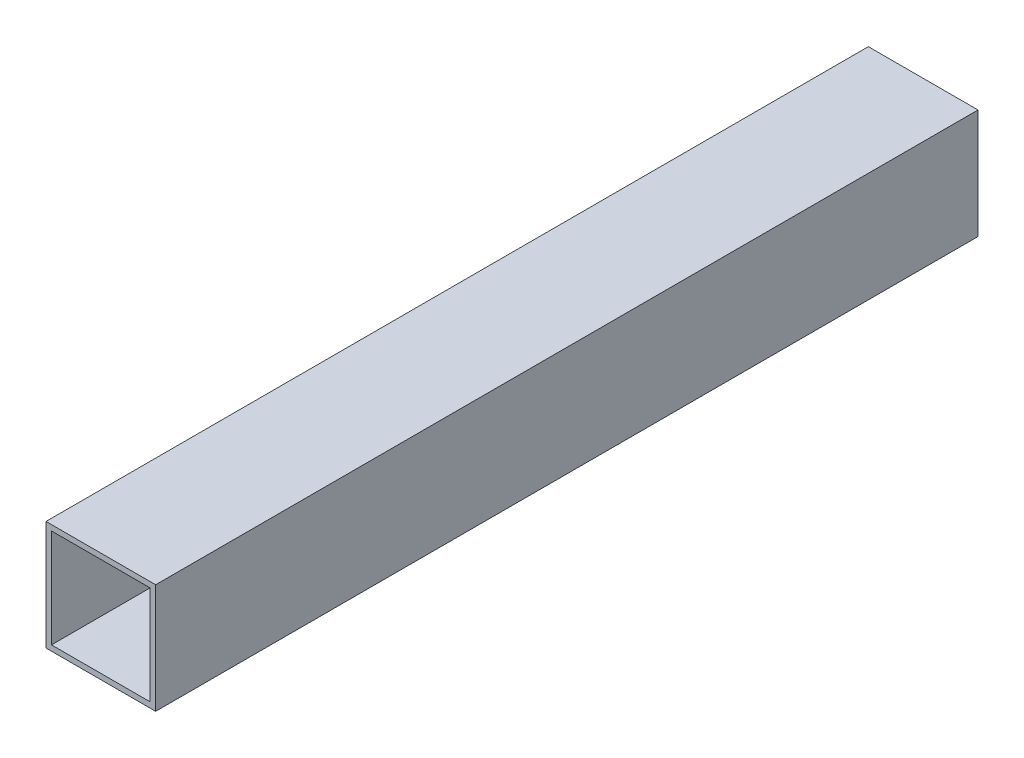
ISO-10303-21;
HEADER;
FILE_DESCRIPTION(('STEP AP214'),'2;1');
FILE_NAME('part.step','',(''),(''),'','','');
FILE_SCHEMA(('AUTOMOTIVE_DESIGN { 1 0 10303 214 1 1 1 1 }'));
ENDSEC;
DATA;
#1=APPLICATION_CONTEXT('core data for automotive mechanical design processes');
#2=APPLICATION_PROTOCOL_DEFINITION('international standard','automotive_design',2000,#1);
#3=PRODUCT_CONTEXT('',#1,'mechanical');
#4=PRODUCT('Part','Part','',(#3));
#5=PRODUCT_RELATED_PRODUCT_CATEGORY('part','',(#4));
#6=PRODUCT_DEFINITION_FORMATION('','',#4);
#7=PRODUCT_DEFINITION_CONTEXT('part definition',#1,'design');
#8=PRODUCT_DEFINITION('design','',#6,#7);
#9=PRODUCT_DEFINITION_SHAPE('','',#8);
#10=(LENGTH_UNIT() NAMED_UNIT(*) SI_UNIT(.MILLI.,.METRE.));
#11=(NAMED_UNIT(*) PLANE_ANGLE_UNIT() SI_UNIT($,.RADIAN.));
#12=(NAMED_UNIT(*) SI_UNIT($,.STERADIAN.) SOLID_ANGLE_UNIT());
#13=UNCERTAINTY_MEASURE_WITH_UNIT(LENGTH_MEASURE(1.E-05),#10,'distance_accuracy_value','');
#14=(GEOMETRIC_REPRESENTATION_CONTEXT(3) GLOBAL_UNCERTAINTY_ASSIGNED_CONTEXT((#13)) GLOBAL_UNIT_ASSIGNED_CONTEXT((#10,
#11,#12)) REPRESENTATION_CONTEXT('',''));
#15=CARTESIAN_POINT('',(0.,0.,0.));
#16=DIRECTION('',(0.,0.,1.));
#17=DIRECTION('',(1.,0.,0.));
#18=AXIS2_PLACEMENT_3D('',#15,#16,#17);
#19=CARTESIAN_POINT('',(0.,0.,150.));
#20=DIRECTION('',(0.,0.,-1.));
#21=DIRECTION('',(-1.,0.,0.));
#22=AXIS2_PLACEMENT_3D('',#19,#20,#21);
#23=PLANE('',#22);
#24=DIRECTION('',(0.,1.,0.));
#25=VECTOR('',#24,1.);
#26=CARTESIAN_POINT('',(12.5,-7.5,150.));
#27=LINE('',#26,#25);
#28=CARTESIAN_POINT('',(12.5,-7.5,150.));
#29=VERTEX_POINT('',#28);
#30=CARTESIAN_POINT('',(12.5,12.5,150.));
#31=VERTEX_POINT('',#30);
#32=EDGE_CURVE('E143',#29,#31,#27,.T.);
#33=ORIENTED_EDGE('',*,*,#32,.T.);
#34=DIRECTION('',(-1.,0.,0.));
#35=VECTOR('',#34,1.);
#36=CARTESIAN_POINT('',(-7.5,12.5,150.));
#37=LINE('',#36,#35);
#38=CARTESIAN_POINT('',(-7.5,12.5,150.));
#39=VERTEX_POINT('',#38);
#40=EDGE_CURVE('E146',#31,#39,#37,.T.);
#41=ORIENTED_EDGE('',*,*,#40,.T.);
#42=DIRECTION('',(0.,-1.,0.));
#43=VECTOR('',#42,1.);
#44=CARTESIAN_POINT('',(-7.5,-7.5,150.));
#45=LINE('',#44,#43);
#46=CARTESIAN_POINT('',(-7.5,-7.5,150.));
#47=VERTEX_POINT('',#46);
#48=EDGE_CURVE('E149',#39,#47,#45,.T.);
#49=ORIENTED_EDGE('',*,*,#48,.T.);
#50=DIRECTION('',(1.,0.,0.));
#51=VECTOR('',#50,1.);
#52=CARTESIAN_POINT('',(-7.5,-7.5,150.));
#53=LINE('',#52,#51);
#54=EDGE_CURVE('E151',#47,#29,#53,.T.);
#55=ORIENTED_EDGE('',*,*,#54,.T.);
#56=EDGE_LOOP('',(#33,#41,#49,#55));
#57=FACE_BOUND('',#56,.T.);
#58=DIRECTION('',(0.,-1.,0.));
#59=VECTOR('',#58,1.);
#60=CARTESIAN_POINT('',(-6.5,-6.5,150.));
#61=LINE('',#60,#59);
#62=CARTESIAN_POINT('',(-6.5,11.5,150.));
#63=VERTEX_POINT('',#62);
#64=CARTESIAN_POINT('',(-6.5,-6.5,150.));
#65=VERTEX_POINT('',#64);
#66=EDGE_CURVE('E107',#63,#65,#61,.T.);
#67=ORIENTED_EDGE('',*,*,#66,.F.);
#68=DIRECTION('',(-1.,0.,0.));
#69=VECTOR('',#68,1.);
#70=CARTESIAN_POINT('',(-6.5,11.5,150.));
#71=LINE('',#70,#69);
#72=CARTESIAN_POINT('',(11.5,11.5,150.));
#73=VERTEX_POINT('',#72);
#74=EDGE_CURVE('E129',#73,#63,#71,.T.);
#75=ORIENTED_EDGE('',*,*,#74,.F.);
#76=DIRECTION('',(0.,1.,0.));
#77=VECTOR('',#76,1.);
#78=CARTESIAN_POINT('',(11.5,-6.5,150.));
#79=LINE('',#78,#77);
#80=CARTESIAN_POINT('',(11.5,-6.5,150.));
#81=VERTEX_POINT('',#80);
#82=EDGE_CURVE('E127',#81,#73,#79,.T.);
#83=ORIENTED_EDGE('',*,*,#82,.F.);
#84=DIRECTION('',(1.,0.,0.));
#85=VECTOR('',#84,1.);
#86=CARTESIAN_POINT('',(-6.5,-6.5,150.));
#87=LINE('',#86,#85);
#88=EDGE_CURVE('E115',#65,#81,#87,.T.);
#89=ORIENTED_EDGE('',*,*,#88,.F.);
#90=EDGE_LOOP('',(#67,#75,#83,#89));
#91=FACE_BOUND('',#90,.T.);
#92=ADVANCED_FACE('F42',(#57,#91),#23,.F.);
#93=CARTESIAN_POINT('',(0.,0.,0.));
#94=DIRECTION('',(0.,0.,-1.));
#95=DIRECTION('',(-1.,0.,0.));
#96=AXIS2_PLACEMENT_3D('',#93,#94,#95);
#97=PLANE('',#96);
#98=DIRECTION('',(0.,1.,0.));
#99=VECTOR('',#98,1.);
#100=CARTESIAN_POINT('',(12.5,-7.5,0.));
#101=LINE('',#100,#99);
#102=CARTESIAN_POINT('',(12.5,-7.5,0.));
#103=VERTEX_POINT('',#102);
#104=CARTESIAN_POINT('',(12.5,12.5,0.));
#105=VERTEX_POINT('',#104);
#106=EDGE_CURVE('E123',#103,#105,#101,.T.);
#107=ORIENTED_EDGE('',*,*,#106,.F.);
#108=DIRECTION('',(1.,0.,0.));
#109=VECTOR('',#108,1.);
#110=CARTESIAN_POINT('',(-7.5,-7.5,0.));
#111=LINE('',#110,#109);
#112=CARTESIAN_POINT('',(-7.5,-7.5,0.));
#113=VERTEX_POINT('',#112);
#114=EDGE_CURVE('E147',#113,#103,#111,.T.);
#115=ORIENTED_EDGE('',*,*,#114,.F.);
#116=DIRECTION('',(0.,-1.,0.));
#117=VECTOR('',#116,1.);
#118=CARTESIAN_POINT('',(-7.5,-7.5,0.));
#119=LINE('',#118,#117);
#120=CARTESIAN_POINT('',(-7.5,12.5,0.));
#121=VERTEX_POINT('',#120);
#122=EDGE_CURVE('E158',#121,#113,#119,.T.);
#123=ORIENTED_EDGE('',*,*,#122,.F.);
#124=DIRECTION('',(-1.,0.,0.));
#125=VECTOR('',#124,1.);
#126=CARTESIAN_POINT('',(-7.5,12.5,0.));
#127=LINE('',#126,#125);
#128=EDGE_CURVE('E156',#105,#121,#127,.T.);
#129=ORIENTED_EDGE('',*,*,#128,.F.);
#130=EDGE_LOOP('',(#107,#115,#123,#129));
#131=FACE_BOUND('',#130,.T.);
#132=DIRECTION('',(-1.,0.,0.));
#133=VECTOR('',#132,1.);
#134=CARTESIAN_POINT('',(-6.5,11.5,0.));
#135=LINE('',#134,#133);
#136=CARTESIAN_POINT('',(11.5,11.5,0.));
#137=VERTEX_POINT('',#136);
#138=CARTESIAN_POINT('',(-6.5,11.5,0.));
#139=VERTEX_POINT('',#138);
#140=EDGE_CURVE('E116',#137,#139,#135,.T.);
#141=ORIENTED_EDGE('',*,*,#140,.T.);
#142=DIRECTION('',(0.,-1.,0.));
#143=VECTOR('',#142,1.);
#144=CARTESIAN_POINT('',(-6.5,-6.5,0.));
#145=LINE('',#144,#143);
#146=CARTESIAN_POINT('',(-6.5,-6.5,0.));
#147=VERTEX_POINT('',#146);
#148=EDGE_CURVE('E65',#139,#147,#145,.T.);
#149=ORIENTED_EDGE('',*,*,#148,.T.);
#150=DIRECTION('',(1.,0.,0.));
#151=VECTOR('',#150,1.);
#152=CARTESIAN_POINT('',(-6.5,-6.5,0.));
#153=LINE('',#152,#151);
#154=CARTESIAN_POINT('',(11.5,-6.5,0.));
#155=VERTEX_POINT('',#154);
#156=EDGE_CURVE('E122',#147,#155,#153,.T.);
#157=ORIENTED_EDGE('',*,*,#156,.T.);
#158=DIRECTION('',(0.,1.,0.));
#159=VECTOR('',#158,1.);
#160=CARTESIAN_POINT('',(11.5,-6.5,0.));
#161=LINE('',#160,#159);
#162=EDGE_CURVE('E135',#155,#137,#161,.T.);
#163=ORIENTED_EDGE('',*,*,#162,.T.);
#164=EDGE_LOOP('',(#141,#149,#157,#163));
#165=FACE_BOUND('',#164,.T.);
#166=ADVANCED_FACE('F176',(#131,#165),#97,.T.);
#167=CARTESIAN_POINT('',(12.5,-7.5,150.));
#168=DIRECTION('',(-1.,0.,0.));
#169=DIRECTION('',(0.,0.,1.));
#170=AXIS2_PLACEMENT_3D('',#167,#168,#169);
#171=PLANE('',#170);
#172=ORIENTED_EDGE('',*,*,#106,.T.);
#173=DIRECTION('',(0.,0.,-1.));
#174=VECTOR('',#173,1.);
#175=CARTESIAN_POINT('',(12.5,12.5,150.));
#176=LINE('',#175,#174);
#177=EDGE_CURVE('E11',#31,#105,#176,.T.);
#178=ORIENTED_EDGE('',*,*,#177,.F.);
#179=ORIENTED_EDGE('',*,*,#32,.F.);
#180=DIRECTION('',(0.,0.,-1.));
#181=VECTOR('',#180,1.);
#182=CARTESIAN_POINT('',(12.5,-7.5,150.));
#183=LINE('',#182,#181);
#184=EDGE_CURVE('E153',#29,#103,#183,.T.);
#185=ORIENTED_EDGE('',*,*,#184,.T.);
#186=EDGE_LOOP('',(#172,#178,#179,#185));
#187=FACE_BOUND('',#186,.T.);
#188=ADVANCED_FACE('F44',(#187),#171,.F.);
#189=CARTESIAN_POINT('',(-7.5,12.5,150.));
#190=DIRECTION('',(0.,-1.,0.));
#191=DIRECTION('',(0.,0.,-1.));
#192=AXIS2_PLACEMENT_3D('',#189,#190,#191);
#193=PLANE('',#192);
#194=ORIENTED_EDGE('',*,*,#128,.T.);
#195=DIRECTION('',(0.,0.,-1.));
#196=VECTOR('',#195,1.);
#197=CARTESIAN_POINT('',(-7.5,12.5,150.));
#198=LINE('',#197,#196);
#199=EDGE_CURVE('E50',#39,#121,#198,.T.);
#200=ORIENTED_EDGE('',*,*,#199,.F.);
#201=ORIENTED_EDGE('',*,*,#40,.F.);
#202=ORIENTED_EDGE('',*,*,#177,.T.);
#203=EDGE_LOOP('',(#194,#200,#201,#202));
#204=FACE_BOUND('',#203,.T.);
#205=ADVANCED_FACE('F186',(#204),#193,.F.);
#206=CARTESIAN_POINT('',(-7.5,-7.5,150.));
#207=DIRECTION('',(1.,0.,0.));
#208=DIRECTION('',(0.,0.,-1.));
#209=AXIS2_PLACEMENT_3D('',#206,#207,#208);
#210=PLANE('',#209);
#211=ORIENTED_EDGE('',*,*,#122,.T.);
#212=DIRECTION('',(0.,0.,-1.));
#213=VECTOR('',#212,1.);
#214=CARTESIAN_POINT('',(-7.5,-7.5,150.));
#215=LINE('',#214,#213);
#216=EDGE_CURVE('E163',#47,#113,#215,.T.);
#217=ORIENTED_EDGE('',*,*,#216,.F.);
#218=ORIENTED_EDGE('',*,*,#48,.F.);
#219=ORIENTED_EDGE('',*,*,#199,.T.);
#220=EDGE_LOOP('',(#211,#217,#218,#219));
#221=FACE_BOUND('',#220,.T.);
#222=ADVANCED_FACE('F170',(#221),#210,.F.);
#223=CARTESIAN_POINT('',(-7.5,-7.5,150.));
#224=DIRECTION('',(0.,1.,0.));
#225=DIRECTION('',(0.,0.,1.));
#226=AXIS2_PLACEMENT_3D('',#223,#224,#225);
#227=PLANE('',#226);
#228=ORIENTED_EDGE('',*,*,#114,.T.);
#229=ORIENTED_EDGE('',*,*,#184,.F.);
#230=ORIENTED_EDGE('',*,*,#54,.F.);
#231=ORIENTED_EDGE('',*,*,#216,.T.);
#232=EDGE_LOOP('',(#228,#229,#230,#231));
#233=FACE_BOUND('',#232,.T.);
#234=ADVANCED_FACE('F180',(#233),#227,.F.);
#235=CARTESIAN_POINT('',(-6.5,-6.5,150.));
#236=DIRECTION('',(1.,0.,0.));
#237=DIRECTION('',(0.,0.,-1.));
#238=AXIS2_PLACEMENT_3D('',#235,#236,#237);
#239=PLANE('',#238);
#240=ORIENTED_EDGE('',*,*,#148,.F.);
#241=DIRECTION('',(0.,0.,-1.));
#242=VECTOR('',#241,1.);
#243=CARTESIAN_POINT('',(-6.5,11.5,150.));
#244=LINE('',#243,#242);
#245=EDGE_CURVE('E111',#63,#139,#244,.T.);
#246=ORIENTED_EDGE('',*,*,#245,.F.);
#247=ORIENTED_EDGE('',*,*,#66,.T.);
#248=DIRECTION('',(0.,0.,-1.));
#249=VECTOR('',#248,1.);
#250=CARTESIAN_POINT('',(-6.5,-6.5,150.));
#251=LINE('',#250,#249);
#252=EDGE_CURVE('E110',#65,#147,#251,.T.);
#253=ORIENTED_EDGE('',*,*,#252,.T.);
#254=EDGE_LOOP('',(#240,#246,#247,#253));
#255=FACE_BOUND('',#254,.T.);
#256=ADVANCED_FACE('F109',(#255),#239,.T.);
#257=CARTESIAN_POINT('',(-6.5,-6.5,150.));
#258=DIRECTION('',(0.,1.,0.));
#259=DIRECTION('',(0.,0.,1.));
#260=AXIS2_PLACEMENT_3D('',#257,#258,#259);
#261=PLANE('',#260);
#262=ORIENTED_EDGE('',*,*,#156,.F.);
#263=ORIENTED_EDGE('',*,*,#252,.F.);
#264=ORIENTED_EDGE('',*,*,#88,.T.);
#265=DIRECTION('',(0.,0.,-1.));
#266=VECTOR('',#265,1.);
#267=CARTESIAN_POINT('',(11.5,-6.5,150.));
#268=LINE('',#267,#266);
#269=EDGE_CURVE('E124',#81,#155,#268,.T.);
#270=ORIENTED_EDGE('',*,*,#269,.T.);
#271=EDGE_LOOP('',(#262,#263,#264,#270));
#272=FACE_BOUND('',#271,.T.);
#273=ADVANCED_FACE('F119',(#272),#261,.T.);
#274=CARTESIAN_POINT('',(11.5,-6.5,150.));
#275=DIRECTION('',(-1.,0.,0.));
#276=DIRECTION('',(0.,0.,1.));
#277=AXIS2_PLACEMENT_3D('',#274,#275,#276);
#278=PLANE('',#277);
#279=ORIENTED_EDGE('',*,*,#162,.F.);
#280=ORIENTED_EDGE('',*,*,#269,.F.);
#281=ORIENTED_EDGE('',*,*,#82,.T.);
#282=DIRECTION('',(0.,0.,-1.));
#283=VECTOR('',#282,1.);
#284=CARTESIAN_POINT('',(11.5,11.5,150.));
#285=LINE('',#284,#283);
#286=EDGE_CURVE('E57',#73,#137,#285,.T.);
#287=ORIENTED_EDGE('',*,*,#286,.T.);
#288=EDGE_LOOP('',(#279,#280,#281,#287));
#289=FACE_BOUND('',#288,.T.);
#290=ADVANCED_FACE('F209',(#289),#278,.T.);
#291=CARTESIAN_POINT('',(-6.5,11.5,150.));
#292=DIRECTION('',(0.,-1.,0.));
#293=DIRECTION('',(1.,0.,0.));
#294=AXIS2_PLACEMENT_3D('',#291,#292,#293);
#295=PLANE('',#294);
#296=ORIENTED_EDGE('',*,*,#140,.F.);
#297=ORIENTED_EDGE('',*,*,#286,.F.);
#298=ORIENTED_EDGE('',*,*,#74,.T.);
#299=ORIENTED_EDGE('',*,*,#245,.T.);
#300=EDGE_LOOP('',(#296,#297,#298,#299));
#301=FACE_BOUND('',#300,.T.);
#302=ADVANCED_FACE('F213',(#301),#295,.T.);
#303=CLOSED_SHELL('',(#92,#166,#188,#205,#222,#234,#256,#273,#290,#302));
#304=MANIFOLD_SOLID_BREP('B2',#303);
#305=ADVANCED_BREP_SHAPE_REPRESENTATION('',(#18,#304),#14);
#306=SHAPE_DEFINITION_REPRESENTATION(#9,#305);
ENDSEC;
END-ISO-10303-21;
